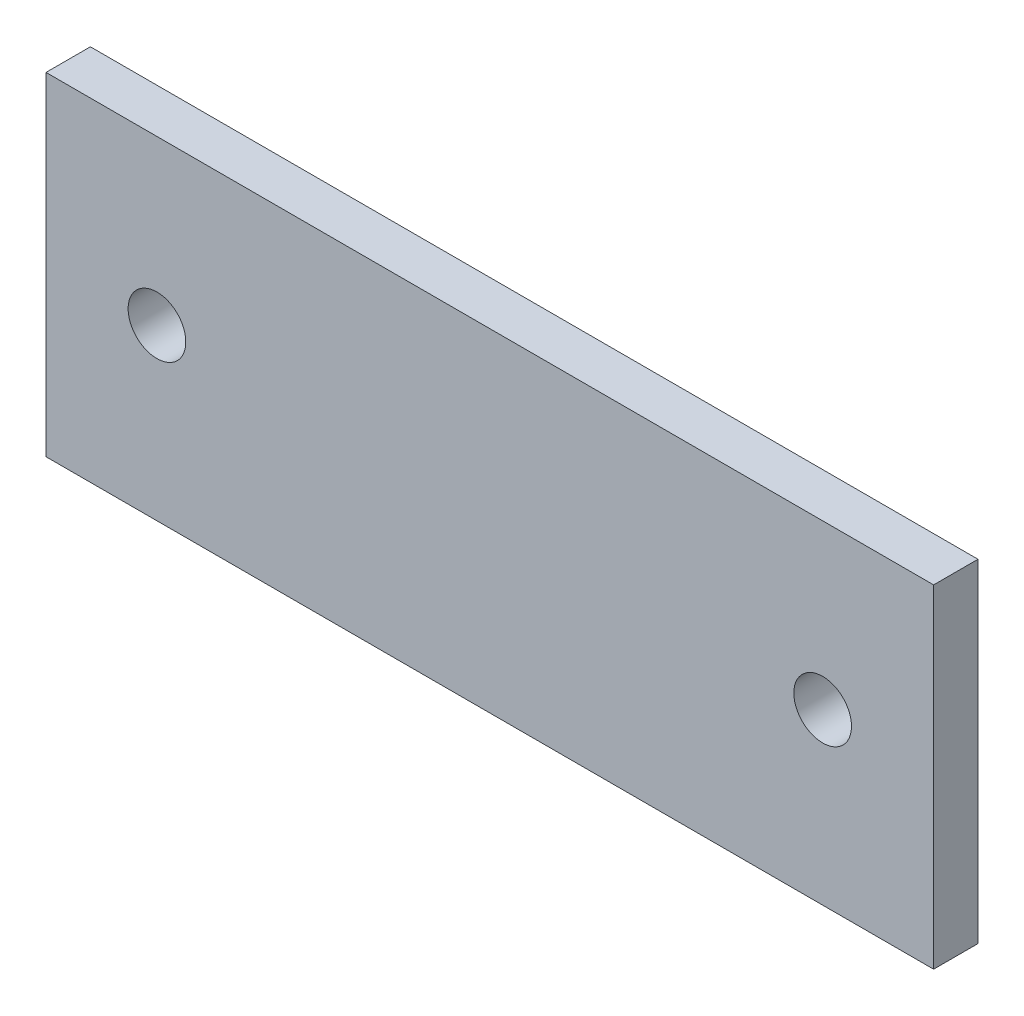
ISO-10303-21;
HEADER;
FILE_DESCRIPTION(('STEP AP214'),'2;1');
FILE_NAME('part.step','',(''),(''),'','','');
FILE_SCHEMA(('AUTOMOTIVE_DESIGN { 1 0 10303 214 1 1 1 1 }'));
ENDSEC;
DATA;
#1=APPLICATION_CONTEXT('core data for automotive mechanical design processes');
#2=APPLICATION_PROTOCOL_DEFINITION('international standard','automotive_design',2000,#1);
#3=PRODUCT_CONTEXT('',#1,'mechanical');
#4=PRODUCT('Part','Part','',(#3));
#5=PRODUCT_RELATED_PRODUCT_CATEGORY('part','',(#4));
#6=PRODUCT_DEFINITION_FORMATION('','',#4);
#7=PRODUCT_DEFINITION_CONTEXT('part definition',#1,'design');
#8=PRODUCT_DEFINITION('design','',#6,#7);
#9=PRODUCT_DEFINITION_SHAPE('','',#8);
#10=(LENGTH_UNIT() NAMED_UNIT(*) SI_UNIT(.MILLI.,.METRE.));
#11=(NAMED_UNIT(*) PLANE_ANGLE_UNIT() SI_UNIT($,.RADIAN.));
#12=(NAMED_UNIT(*) SI_UNIT($,.STERADIAN.) SOLID_ANGLE_UNIT());
#13=UNCERTAINTY_MEASURE_WITH_UNIT(LENGTH_MEASURE(1.E-05),#10,'distance_accuracy_value','');
#14=(GEOMETRIC_REPRESENTATION_CONTEXT(3) GLOBAL_UNCERTAINTY_ASSIGNED_CONTEXT((#13)) GLOBAL_UNIT_ASSIGNED_CONTEXT((#10,
#11,#12)) REPRESENTATION_CONTEXT('',''));
#15=CARTESIAN_POINT('',(0.,0.,0.));
#16=DIRECTION('',(0.,0.,1.));
#17=DIRECTION('',(1.,0.,0.));
#18=AXIS2_PLACEMENT_3D('',#15,#16,#17);
#19=CARTESIAN_POINT('',(2.22044604925031E-13,149.999999999999,19.9999999999998));
#20=DIRECTION('',(0.,0.,-1.));
#21=DIRECTION('',(-0.999999999999999,0.,0.));
#22=AXIS2_PLACEMENT_3D('',#19,#20,#21);
#23=PLANE('',#22);
#24=CARTESIAN_POINT('',(49.9999999999997,76.300665856392,19.9999999999997));
#25=DIRECTION('',(0.,0.,1.));
#26=DIRECTION('',(0.999999999999999,0.,0.));
#27=AXIS2_PLACEMENT_3D('',#24,#25,#26);
#28=CIRCLE('',#27,13.);
#29=CARTESIAN_POINT('',(36.9999999999997,76.300665856392,19.9999999999997));
#30=VERTEX_POINT('',#29);
#31=EDGE_CURVE('E93',#30,#30,#28,.T.);
#32=ORIENTED_EDGE('',*,*,#31,.F.);
#33=EDGE_LOOP('',(#32));
#34=FACE_BOUND('',#33,.T.);
#35=DIRECTION('',(0.,-0.999999999999998,0.));
#36=VECTOR('',#35,1.);
#37=CARTESIAN_POINT('',(2.22044604925031E-13,-4.44089209850063E-13,20.));
#38=LINE('',#37,#36);
#39=CARTESIAN_POINT('',(2.22044604925031E-13,149.999999999999,19.9999999999998));
#40=VERTEX_POINT('',#39);
#41=CARTESIAN_POINT('',(2.22044604925031E-13,-4.44089209850063E-13,20.));
#42=VERTEX_POINT('',#41);
#43=EDGE_CURVE('E103',#40,#42,#38,.T.);
#44=ORIENTED_EDGE('',*,*,#43,.T.);
#45=DIRECTION('',(0.999999999999999,0.,0.));
#46=VECTOR('',#45,1.);
#47=CARTESIAN_POINT('',(2.22044604925031E-13,-4.44089209850063E-13,20.));
#48=LINE('',#47,#46);
#49=CARTESIAN_POINT('',(400.,-4.44089209850063E-13,20.));
#50=VERTEX_POINT('',#49);
#51=EDGE_CURVE('E88',#42,#50,#48,.T.);
#52=ORIENTED_EDGE('',*,*,#51,.T.);
#53=DIRECTION('',(0.,0.999999999999998,0.));
#54=VECTOR('',#53,1.);
#55=CARTESIAN_POINT('',(400.,-4.44089209850063E-13,20.));
#56=LINE('',#55,#54);
#57=CARTESIAN_POINT('',(399.999999999999,149.999999999999,19.9999999999999));
#58=VERTEX_POINT('',#57);
#59=EDGE_CURVE('E54',#50,#58,#56,.T.);
#60=ORIENTED_EDGE('',*,*,#59,.T.);
#61=DIRECTION('',(-0.999999999999999,0.,0.));
#62=VECTOR('',#61,1.);
#63=CARTESIAN_POINT('',(2.22044604925031E-13,149.999999999999,19.9999999999998));
#64=LINE('',#63,#62);
#65=EDGE_CURVE('E49',#58,#40,#64,.T.);
#66=ORIENTED_EDGE('',*,*,#65,.T.);
#67=EDGE_LOOP('',(#44,#52,#60,#66));
#68=FACE_BOUND('',#67,.T.);
#69=CARTESIAN_POINT('',(350.,76.3006658563926,19.9999999999997));
#70=DIRECTION('',(0.,0.,1.));
#71=DIRECTION('',(0.999999999999999,0.,0.));
#72=AXIS2_PLACEMENT_3D('',#69,#70,#71);
#73=CIRCLE('',#72,13.);
#74=CARTESIAN_POINT('',(337.,76.3006658563926,19.9999999999997));
#75=VERTEX_POINT('',#74);
#76=EDGE_CURVE('E121',#75,#75,#73,.T.);
#77=ORIENTED_EDGE('',*,*,#76,.F.);
#78=EDGE_LOOP('',(#77));
#79=FACE_BOUND('',#78,.T.);
#80=ADVANCED_FACE('F34',(#34,#68,#79),#23,.F.);
#81=CARTESIAN_POINT('',(2.22044604925031E-13,149.999999999999,-1.66533453693773E-13));
#82=DIRECTION('',(0.,0.,-1.));
#83=DIRECTION('',(-0.999999999999999,0.,0.));
#84=AXIS2_PLACEMENT_3D('',#81,#82,#83);
#85=PLANE('',#84);
#86=CARTESIAN_POINT('',(50.,76.300665856392,-3.33066907387547E-13));
#87=DIRECTION('',(0.,0.,1.));
#88=DIRECTION('',(0.999999999999999,0.,0.));
#89=AXIS2_PLACEMENT_3D('',#86,#87,#88);
#90=CIRCLE('',#89,13.);
#91=CARTESIAN_POINT('',(36.9999999999997,76.300665856392,-3.29597460435593E-13));
#92=VERTEX_POINT('',#91);
#93=EDGE_CURVE('E96',#92,#92,#90,.T.);
#94=ORIENTED_EDGE('',*,*,#93,.T.);
#95=EDGE_LOOP('',(#94));
#96=FACE_BOUND('',#95,.T.);
#97=DIRECTION('',(0.,-0.999999999999998,0.));
#98=VECTOR('',#97,1.);
#99=CARTESIAN_POINT('',(0.,0.,0.));
#100=LINE('',#99,#98);
#101=CARTESIAN_POINT('',(2.22044604925031E-13,149.999999999999,-1.66533453693773E-13));
#102=VERTEX_POINT('',#101);
#103=CARTESIAN_POINT('',(0.,0.,0.));
#104=VERTEX_POINT('',#103);
#105=EDGE_CURVE('E80',#102,#104,#100,.T.);
#106=ORIENTED_EDGE('',*,*,#105,.F.);
#107=DIRECTION('',(-0.999999999999999,0.,0.));
#108=VECTOR('',#107,1.);
#109=CARTESIAN_POINT('',(2.22044604925031E-13,149.999999999999,-1.66533453693773E-13));
#110=LINE('',#109,#108);
#111=CARTESIAN_POINT('',(400.,149.999999999999,-1.11022302462516E-13));
#112=VERTEX_POINT('',#111);
#113=EDGE_CURVE('E101',#112,#102,#110,.T.);
#114=ORIENTED_EDGE('',*,*,#113,.F.);
#115=DIRECTION('',(0.,0.999999999999998,0.));
#116=VECTOR('',#115,1.);
#117=CARTESIAN_POINT('',(399.999999999999,0.,-1.11022302462516E-13));
#118=LINE('',#117,#116);
#119=CARTESIAN_POINT('',(399.999999999999,0.,-1.11022302462516E-13));
#120=VERTEX_POINT('',#119);
#121=EDGE_CURVE('E81',#120,#112,#118,.T.);
#122=ORIENTED_EDGE('',*,*,#121,.F.);
#123=DIRECTION('',(0.999999999999999,0.,0.));
#124=VECTOR('',#123,1.);
#125=CARTESIAN_POINT('',(0.,0.,0.));
#126=LINE('',#125,#124);
#127=EDGE_CURVE('E75',#104,#120,#126,.T.);
#128=ORIENTED_EDGE('',*,*,#127,.F.);
#129=EDGE_LOOP('',(#106,#114,#122,#128));
#130=FACE_BOUND('',#129,.T.);
#131=CARTESIAN_POINT('',(350.,76.3006658563924,-2.22044604925031E-13));
#132=DIRECTION('',(0.,0.,1.));
#133=DIRECTION('',(0.999999999999999,0.,0.));
#134=AXIS2_PLACEMENT_3D('',#131,#132,#133);
#135=CIRCLE('',#134,13.);
#136=CARTESIAN_POINT('',(337.,76.3006658563926,-2.18575157973078E-13));
#137=VERTEX_POINT('',#136);
#138=EDGE_CURVE('E123',#137,#137,#135,.T.);
#139=ORIENTED_EDGE('',*,*,#138,.T.);
#140=EDGE_LOOP('',(#139));
#141=FACE_BOUND('',#140,.T.);
#142=ADVANCED_FACE('F76',(#96,#130,#141),#85,.T.);
#143=CARTESIAN_POINT('',(2.22044604925031E-13,-4.44089209850063E-13,20.));
#144=DIRECTION('',(0.999999999999999,0.,0.));
#145=DIRECTION('',(0.,0.,-1.));
#146=AXIS2_PLACEMENT_3D('',#143,#144,#145);
#147=PLANE('',#146);
#148=ORIENTED_EDGE('',*,*,#105,.T.);
#149=DIRECTION('',(0.,0.,-1.));
#150=VECTOR('',#149,1.);
#151=CARTESIAN_POINT('',(2.22044604925031E-13,-4.44089209850063E-13,20.));
#152=LINE('',#151,#150);
#153=EDGE_CURVE('E11',#42,#104,#152,.T.);
#154=ORIENTED_EDGE('',*,*,#153,.F.);
#155=ORIENTED_EDGE('',*,*,#43,.F.);
#156=DIRECTION('',(0.,0.,-1.));
#157=VECTOR('',#156,1.);
#158=CARTESIAN_POINT('',(2.22044604925031E-13,149.999999999999,19.9999999999998));
#159=LINE('',#158,#157);
#160=EDGE_CURVE('E92',#40,#102,#159,.T.);
#161=ORIENTED_EDGE('',*,*,#160,.T.);
#162=EDGE_LOOP('',(#148,#154,#155,#161));
#163=FACE_BOUND('',#162,.T.);
#164=ADVANCED_FACE('F36',(#163),#147,.F.);
#165=CARTESIAN_POINT('',(2.22044604925031E-13,-4.44089209850063E-13,20.));
#166=DIRECTION('',(0.,0.999999999999998,0.));
#167=DIRECTION('',(0.,0.,1.));
#168=AXIS2_PLACEMENT_3D('',#165,#166,#167);
#169=PLANE('',#168);
#170=ORIENTED_EDGE('',*,*,#127,.T.);
#171=DIRECTION('',(0.,0.,-1.));
#172=VECTOR('',#171,1.);
#173=CARTESIAN_POINT('',(400.,-4.44089209850063E-13,20.));
#174=LINE('',#173,#172);
#175=EDGE_CURVE('E42',#50,#120,#174,.T.);
#176=ORIENTED_EDGE('',*,*,#175,.F.);
#177=ORIENTED_EDGE('',*,*,#51,.F.);
#178=ORIENTED_EDGE('',*,*,#153,.T.);
#179=EDGE_LOOP('',(#170,#176,#177,#178));
#180=FACE_BOUND('',#179,.T.);
#181=ADVANCED_FACE('F87',(#180),#169,.F.);
#182=CARTESIAN_POINT('',(400.,-4.44089209850063E-13,20.));
#183=DIRECTION('',(-0.999999999999999,0.,0.));
#184=DIRECTION('',(0.,0.,1.));
#185=AXIS2_PLACEMENT_3D('',#182,#183,#184);
#186=PLANE('',#185);
#187=ORIENTED_EDGE('',*,*,#121,.T.);
#188=DIRECTION('',(0.,0.,-1.));
#189=VECTOR('',#188,1.);
#190=CARTESIAN_POINT('',(399.999999999999,149.999999999999,19.9999999999999));
#191=LINE('',#190,#189);
#192=EDGE_CURVE('E109',#58,#112,#191,.T.);
#193=ORIENTED_EDGE('',*,*,#192,.F.);
#194=ORIENTED_EDGE('',*,*,#59,.F.);
#195=ORIENTED_EDGE('',*,*,#175,.T.);
#196=EDGE_LOOP('',(#187,#193,#194,#195));
#197=FACE_BOUND('',#196,.T.);
#198=ADVANCED_FACE('F112',(#197),#186,.F.);
#199=CARTESIAN_POINT('',(2.22044604925031E-13,149.999999999999,19.9999999999998));
#200=DIRECTION('',(0.,-0.999999999999998,0.));
#201=DIRECTION('',(0.,0.,-1.));
#202=AXIS2_PLACEMENT_3D('',#199,#200,#201);
#203=PLANE('',#202);
#204=ORIENTED_EDGE('',*,*,#113,.T.);
#205=ORIENTED_EDGE('',*,*,#160,.F.);
#206=ORIENTED_EDGE('',*,*,#65,.F.);
#207=ORIENTED_EDGE('',*,*,#192,.T.);
#208=EDGE_LOOP('',(#204,#205,#206,#207));
#209=FACE_BOUND('',#208,.T.);
#210=ADVANCED_FACE('F114',(#209),#203,.F.);
#211=CARTESIAN_POINT('',(49.9999999999997,76.300665856392,19.9999999999997));
#212=DIRECTION('',(0.,0.,-1.));
#213=DIRECTION('',(-0.999999999999999,0.,0.));
#214=AXIS2_PLACEMENT_3D('',#211,#212,#213);
#215=CYLINDRICAL_SURFACE('',#214,13.);
#216=CARTESIAN_POINT('',(36.9999999999997,76.300665856392,19.9999999999997));
#217=CARTESIAN_POINT('',(36.9999999999997,76.300665856392,19.7916666666664));
#218=CARTESIAN_POINT('',(36.9999999999997,76.300665856392,19.5833333333331));
#219=CARTESIAN_POINT('',(36.9999999999997,76.300665856392,19.1666666666664));
#220=CARTESIAN_POINT('',(36.9999999999997,76.300665856392,18.9583333333331));
#221=CARTESIAN_POINT('',(36.9999999999997,76.300665856392,18.5416666666664));
#222=CARTESIAN_POINT('',(36.9999999999997,76.300665856392,18.3333333333331));
#223=CARTESIAN_POINT('',(36.9999999999997,76.300665856392,17.9166666666664));
#224=CARTESIAN_POINT('',(36.9999999999997,76.300665856392,17.7083333333331));
#225=CARTESIAN_POINT('',(36.9999999999997,76.300665856392,17.2916666666664));
#226=CARTESIAN_POINT('',(36.9999999999997,76.300665856392,17.0833333333331));
#227=CARTESIAN_POINT('',(36.9999999999997,76.300665856392,16.6666666666664));
#228=CARTESIAN_POINT('',(36.9999999999997,76.300665856392,16.4583333333331));
#229=CARTESIAN_POINT('',(36.9999999999997,76.300665856392,16.0416666666664));
#230=CARTESIAN_POINT('',(36.9999999999997,76.300665856392,15.8333333333331));
#231=CARTESIAN_POINT('',(36.9999999999997,76.300665856392,15.4166666666664));
#232=CARTESIAN_POINT('',(36.9999999999997,76.300665856392,15.2083333333331));
#233=CARTESIAN_POINT('',(36.9999999999997,76.300665856392,14.7916666666664));
#234=CARTESIAN_POINT('',(36.9999999999997,76.300665856392,14.5833333333331));
#235=CARTESIAN_POINT('',(36.9999999999997,76.300665856392,14.1666666666664));
#236=CARTESIAN_POINT('',(36.9999999999997,76.300665856392,13.9583333333331));
#237=CARTESIAN_POINT('',(36.9999999999997,76.300665856392,13.5416666666664));
#238=CARTESIAN_POINT('',(36.9999999999997,76.300665856392,13.333333333333));
#239=CARTESIAN_POINT('',(36.9999999999997,76.300665856392,12.9166666666664));
#240=CARTESIAN_POINT('',(36.9999999999997,76.300665856392,12.708333333333));
#241=CARTESIAN_POINT('',(36.9999999999997,76.300665856392,12.2916666666664));
#242=CARTESIAN_POINT('',(36.9999999999997,76.300665856392,12.083333333333));
#243=CARTESIAN_POINT('',(36.9999999999997,76.300665856392,11.6666666666664));
#244=CARTESIAN_POINT('',(36.9999999999997,76.300665856392,11.458333333333));
#245=CARTESIAN_POINT('',(36.9999999999997,76.300665856392,11.0416666666664));
#246=CARTESIAN_POINT('',(36.9999999999997,76.300665856392,10.833333333333));
#247=CARTESIAN_POINT('',(36.9999999999997,76.300665856392,10.4166666666664));
#248=CARTESIAN_POINT('',(36.9999999999997,76.300665856392,10.208333333333));
#249=CARTESIAN_POINT('',(36.9999999999997,76.300665856392,9.79166666666637));
#250=CARTESIAN_POINT('',(36.9999999999997,76.300665856392,9.58333333333304));
#251=CARTESIAN_POINT('',(36.9999999999997,76.300665856392,9.16666666666637));
#252=CARTESIAN_POINT('',(36.9999999999997,76.300665856392,8.95833333333304));
#253=CARTESIAN_POINT('',(36.9999999999997,76.300665856392,8.54166666666637));
#254=CARTESIAN_POINT('',(36.9999999999997,76.300665856392,8.33333333333303));
#255=CARTESIAN_POINT('',(36.9999999999997,76.300665856392,7.91666666666636));
#256=CARTESIAN_POINT('',(36.9999999999997,76.300665856392,7.70833333333303));
#257=CARTESIAN_POINT('',(36.9999999999997,76.300665856392,7.29166666666636));
#258=CARTESIAN_POINT('',(36.9999999999997,76.300665856392,7.08333333333303));
#259=CARTESIAN_POINT('',(36.9999999999997,76.300665856392,6.66666666666636));
#260=CARTESIAN_POINT('',(36.9999999999997,76.300665856392,6.45833333333303));
#261=CARTESIAN_POINT('',(36.9999999999997,76.300665856392,6.04166666666636));
#262=CARTESIAN_POINT('',(36.9999999999997,76.300665856392,5.83333333333302));
#263=CARTESIAN_POINT('',(36.9999999999997,76.300665856392,5.41666666666636));
#264=CARTESIAN_POINT('',(36.9999999999997,76.300665856392,5.20833333333302));
#265=CARTESIAN_POINT('',(36.9999999999997,76.300665856392,4.79166666666635));
#266=CARTESIAN_POINT('',(36.9999999999997,76.300665856392,4.58333333333302));
#267=CARTESIAN_POINT('',(36.9999999999997,76.300665856392,4.16666666666635));
#268=CARTESIAN_POINT('',(36.9999999999997,76.300665856392,3.95833333333302));
#269=CARTESIAN_POINT('',(36.9999999999997,76.300665856392,3.54166666666635));
#270=CARTESIAN_POINT('',(36.9999999999997,76.300665856392,3.33333333333301));
#271=CARTESIAN_POINT('',(36.9999999999997,76.300665856392,2.91666666666635));
#272=CARTESIAN_POINT('',(36.9999999999997,76.300665856392,2.70833333333301));
#273=CARTESIAN_POINT('',(36.9999999999997,76.300665856392,2.29166666666634));
#274=CARTESIAN_POINT('',(36.9999999999997,76.300665856392,2.08333333333301));
#275=CARTESIAN_POINT('',(36.9999999999997,76.300665856392,1.66666666666634));
#276=CARTESIAN_POINT('',(36.9999999999997,76.300665856392,1.45833333333301));
#277=CARTESIAN_POINT('',(36.9999999999997,76.300665856392,1.04166666666634));
#278=CARTESIAN_POINT('',(36.9999999999997,76.300665856392,0.833333333333005));
#279=CARTESIAN_POINT('',(36.9999999999997,76.300665856392,0.416666666666337));
#280=CARTESIAN_POINT('',(36.9999999999997,76.300665856392,0.208333333333004));
#281=CARTESIAN_POINT('',(36.9999999999997,76.300665856392,-3.29597460435593E-13));
#282=B_SPLINE_CURVE_WITH_KNOTS('',3,(#216,#217,#218,#219,#220,#221,#222,#223,#224,#225,#226,
#227,#228,#229,#230,#231,#232,#233,#234,#235,#236,#237,#238,#239,#240,#241,#242,#243,#244,#245,
#246,#247,#248,#249,#250,#251,#252,#253,#254,#255,#256,#257,#258,#259,#260,#261,#262,#263,#264,
#265,#266,#267,#268,#269,#270,#271,#272,#273,#274,#275,#276,#277,#278,#279,#280,#281),
.UNSPECIFIED.,.F.,.F.,(4,2,2,2,2,2,2,2,2,2,2,2,2,2,2,2,2,2,2,2,2,2,2,2,2,2,2,2,2,2,2,2,4),(0.,
0.625000000000004,1.25,1.87500000000001,2.50000000000001,3.12500000000001,3.75000000000001,
4.37500000000002,5.00000000000002,5.62500000000002,6.25000000000003,6.87500000000003,
7.50000000000003,8.12500000000003,8.75000000000004,9.37500000000004,10.,10.625,11.25,11.875,
12.5,13.1250000000001,13.7500000000001,14.3750000000001,15.0000000000001,15.6250000000001,
16.2500000000001,16.8750000000001,17.5000000000001,18.1250000000001,18.7500000000001,
19.3750000000001,20.0000000000001),.UNSPECIFIED.);
#283=EDGE_CURVE('BSEAM132',#30,#92,#282,.T.);
#284=ORIENTED_EDGE('',*,*,#31,.T.);
#285=ORIENTED_EDGE('',*,*,#93,.F.);
#286=ORIENTED_EDGE('',*,*,#283,.T.);
#287=ORIENTED_EDGE('',*,*,#283,.F.);
#288=EDGE_LOOP('',(#284,#286,#285,#287));
#289=FACE_BOUND('',#288,.T.);
#290=ADVANCED_FACE('F132',(#289),#215,.F.);
#291=CARTESIAN_POINT('',(350.,76.3006658563926,19.9999999999997));
#292=DIRECTION('',(0.,0.,-1.));
#293=DIRECTION('',(-0.999999999999999,0.,0.));
#294=AXIS2_PLACEMENT_3D('',#291,#292,#293);
#295=CYLINDRICAL_SURFACE('',#294,13.);
#296=CARTESIAN_POINT('',(337.,76.3006658563926,19.9999999999997));
#297=CARTESIAN_POINT('',(337.,76.3006658563926,19.7916666666664));
#298=CARTESIAN_POINT('',(337.,76.3006658563926,19.583333333333));
#299=CARTESIAN_POINT('',(337.,76.3006658563926,19.1666666666664));
#300=CARTESIAN_POINT('',(337.,76.3006658563926,18.958333333333));
#301=CARTESIAN_POINT('',(337.,76.3006658563926,18.5416666666664));
#302=CARTESIAN_POINT('',(337.,76.3006658563926,18.333333333333));
#303=CARTESIAN_POINT('',(337.,76.3006658563926,17.9166666666664));
#304=CARTESIAN_POINT('',(337.,76.3006658563926,17.708333333333));
#305=CARTESIAN_POINT('',(337.,76.3006658563926,17.2916666666664));
#306=CARTESIAN_POINT('',(337.,76.3006658563926,17.083333333333));
#307=CARTESIAN_POINT('',(337.,76.3006658563926,16.6666666666664));
#308=CARTESIAN_POINT('',(337.,76.3006658563926,16.458333333333));
#309=CARTESIAN_POINT('',(337.,76.3006658563926,16.0416666666664));
#310=CARTESIAN_POINT('',(337.,76.3006658563926,15.833333333333));
#311=CARTESIAN_POINT('',(337.,76.3006658563926,15.4166666666664));
#312=CARTESIAN_POINT('',(337.,76.3006658563926,15.208333333333));
#313=CARTESIAN_POINT('',(337.,76.3006658563926,14.7916666666664));
#314=CARTESIAN_POINT('',(337.,76.3006658563926,14.583333333333));
#315=CARTESIAN_POINT('',(337.,76.3006658563926,14.1666666666664));
#316=CARTESIAN_POINT('',(337.,76.3006658563926,13.958333333333));
#317=CARTESIAN_POINT('',(337.,76.3006658563926,13.5416666666664));
#318=CARTESIAN_POINT('',(337.,76.3006658563926,13.3333333333331));
#319=CARTESIAN_POINT('',(337.,76.3006658563926,12.9166666666664));
#320=CARTESIAN_POINT('',(337.,76.3006658563926,12.7083333333331));
#321=CARTESIAN_POINT('',(337.,76.3006658563926,12.2916666666664));
#322=CARTESIAN_POINT('',(337.,76.3006658563926,12.0833333333331));
#323=CARTESIAN_POINT('',(337.,76.3006658563926,11.6666666666664));
#324=CARTESIAN_POINT('',(337.,76.3006658563926,11.4583333333331));
#325=CARTESIAN_POINT('',(337.,76.3006658563926,11.0416666666664));
#326=CARTESIAN_POINT('',(337.,76.3006658563926,10.8333333333331));
#327=CARTESIAN_POINT('',(337.,76.3006658563926,10.4166666666664));
#328=CARTESIAN_POINT('',(337.,76.3006658563926,10.2083333333331));
#329=CARTESIAN_POINT('',(337.,76.3006658563926,9.7916666666664));
#330=CARTESIAN_POINT('',(337.,76.3006658563926,9.58333333333307));
#331=CARTESIAN_POINT('',(337.,76.3006658563926,9.1666666666664));
#332=CARTESIAN_POINT('',(337.,76.3006658563926,8.95833333333307));
#333=CARTESIAN_POINT('',(337.,76.3006658563926,8.54166666666641));
#334=CARTESIAN_POINT('',(337.,76.3006658563926,8.33333333333308));
#335=CARTESIAN_POINT('',(337.,76.3006658563926,7.91666666666641));
#336=CARTESIAN_POINT('',(337.,76.3006658563926,7.70833333333308));
#337=CARTESIAN_POINT('',(337.,76.3006658563926,7.29166666666641));
#338=CARTESIAN_POINT('',(337.,76.3006658563926,7.08333333333308));
#339=CARTESIAN_POINT('',(337.,76.3006658563926,6.66666666666642));
#340=CARTESIAN_POINT('',(337.,76.3006658563926,6.45833333333308));
#341=CARTESIAN_POINT('',(337.,76.3006658563926,6.04166666666642));
#342=CARTESIAN_POINT('',(337.,76.3006658563926,5.83333333333309));
#343=CARTESIAN_POINT('',(337.,76.3006658563926,5.41666666666642));
#344=CARTESIAN_POINT('',(337.,76.3006658563926,5.20833333333309));
#345=CARTESIAN_POINT('',(337.,76.3006658563926,4.79166666666643));
#346=CARTESIAN_POINT('',(337.,76.3006658563926,4.58333333333309));
#347=CARTESIAN_POINT('',(337.,76.3006658563926,4.16666666666643));
#348=CARTESIAN_POINT('',(337.,76.3006658563926,3.95833333333309));
#349=CARTESIAN_POINT('',(337.,76.3006658563926,3.54166666666643));
#350=CARTESIAN_POINT('',(337.,76.3006658563926,3.3333333333331));
#351=CARTESIAN_POINT('',(337.,76.3006658563926,2.91666666666643));
#352=CARTESIAN_POINT('',(337.,76.3006658563926,2.7083333333331));
#353=CARTESIAN_POINT('',(337.,76.3006658563926,2.29166666666643));
#354=CARTESIAN_POINT('',(337.,76.3006658563926,2.0833333333331));
#355=CARTESIAN_POINT('',(337.,76.3006658563926,1.66666666666644));
#356=CARTESIAN_POINT('',(337.,76.3006658563926,1.4583333333331));
#357=CARTESIAN_POINT('',(337.,76.3006658563926,1.04166666666644));
#358=CARTESIAN_POINT('',(337.,76.3006658563926,0.833333333333108));
#359=CARTESIAN_POINT('',(337.,76.3006658563926,0.416666666666444));
#360=CARTESIAN_POINT('',(337.,76.3006658563926,0.208333333333113));
#361=CARTESIAN_POINT('',(337.,76.3006658563926,-2.18575157973078E-13));
#362=B_SPLINE_CURVE_WITH_KNOTS('',3,(#296,#297,#298,#299,#300,#301,#302,#303,#304,#305,#306,
#307,#308,#309,#310,#311,#312,#313,#314,#315,#316,#317,#318,#319,#320,#321,#322,#323,#324,#325,
#326,#327,#328,#329,#330,#331,#332,#333,#334,#335,#336,#337,#338,#339,#340,#341,#342,#343,#344,
#345,#346,#347,#348,#349,#350,#351,#352,#353,#354,#355,#356,#357,#358,#359,#360,#361),
.UNSPECIFIED.,.F.,.F.,(4,2,2,2,2,2,2,2,2,2,2,2,2,2,2,2,2,2,2,2,2,2,2,2,2,2,2,2,2,2,2,2,4),(0.,
0.624999999999994,1.24999999999999,1.87499999999999,2.49999999999998,3.12499999999998,
3.74999999999998,4.37499999999998,4.99999999999997,5.62499999999997,6.24999999999997,
6.87499999999996,7.49999999999996,8.12499999999996,8.74999999999996,9.37499999999995,
9.99999999999995,10.6249999999999,11.2499999999999,11.8749999999999,12.4999999999999,
13.1249999999999,13.7499999999999,14.3749999999999,14.9999999999999,15.6249999999999,
16.2499999999999,16.8749999999999,17.4999999999999,18.1249999999999,18.7499999999999,
19.3749999999999,19.9999999999999),.UNSPECIFIED.);
#363=EDGE_CURVE('BSEAM130',#75,#137,#362,.T.);
#364=ORIENTED_EDGE('',*,*,#76,.T.);
#365=ORIENTED_EDGE('',*,*,#138,.F.);
#366=ORIENTED_EDGE('',*,*,#363,.T.);
#367=ORIENTED_EDGE('',*,*,#363,.F.);
#368=EDGE_LOOP('',(#364,#366,#365,#367));
#369=FACE_BOUND('',#368,.T.);
#370=ADVANCED_FACE('F130',(#369),#295,.F.);
#371=CLOSED_SHELL('',(#80,#142,#164,#181,#198,#210,#290,#370));
#372=MANIFOLD_SOLID_BREP('B2',#371);
#373=ADVANCED_BREP_SHAPE_REPRESENTATION('',(#18,#372),#14);
#374=SHAPE_DEFINITION_REPRESENTATION(#9,#373);
ENDSEC;
END-ISO-10303-21;
